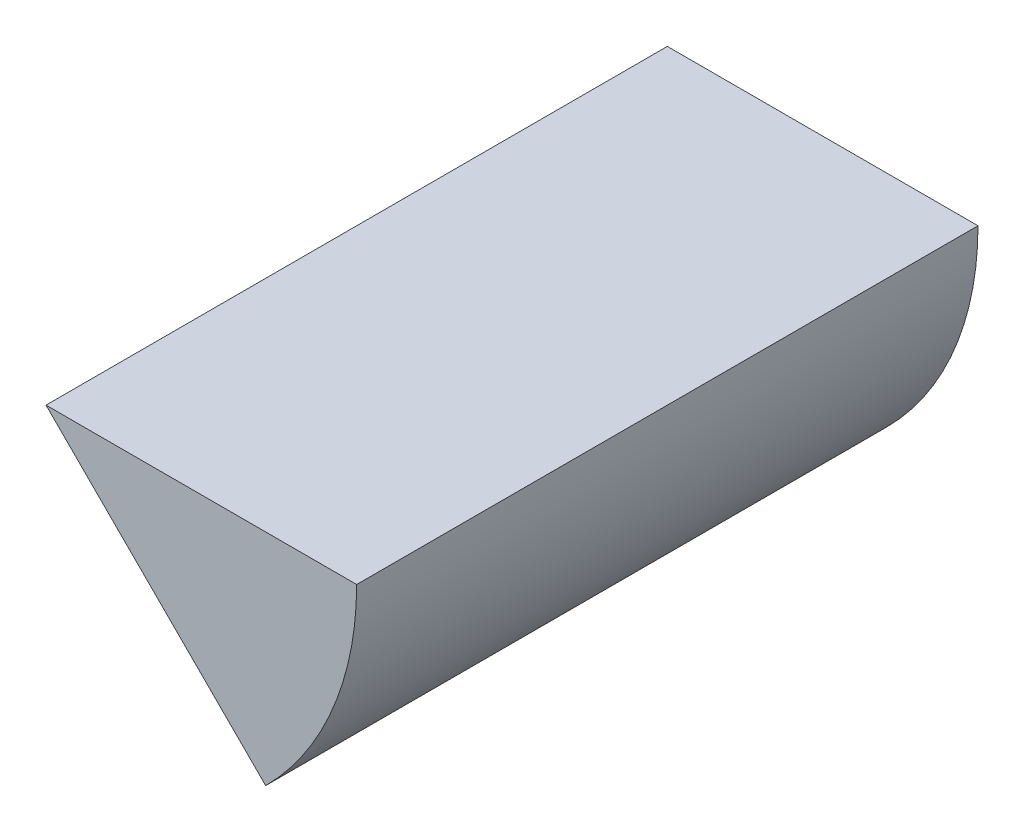
ISO-10303-21;
HEADER;
FILE_DESCRIPTION(('STEP AP214'),'2;1');
FILE_NAME('part.step','',(''),(''),'','','');
FILE_SCHEMA(('AUTOMOTIVE_DESIGN { 1 0 10303 214 1 1 1 1 }'));
ENDSEC;
DATA;
#1=APPLICATION_CONTEXT('core data for automotive mechanical design processes');
#2=APPLICATION_PROTOCOL_DEFINITION('international standard','automotive_design',2000,#1);
#3=PRODUCT_CONTEXT('',#1,'mechanical');
#4=PRODUCT('Part','Part','',(#3));
#5=PRODUCT_RELATED_PRODUCT_CATEGORY('part','',(#4));
#6=PRODUCT_DEFINITION_FORMATION('','',#4);
#7=PRODUCT_DEFINITION_CONTEXT('part definition',#1,'design');
#8=PRODUCT_DEFINITION('design','',#6,#7);
#9=PRODUCT_DEFINITION_SHAPE('','',#8);
#10=(LENGTH_UNIT() NAMED_UNIT(*) SI_UNIT(.MILLI.,.METRE.));
#11=(NAMED_UNIT(*) PLANE_ANGLE_UNIT() SI_UNIT($,.RADIAN.));
#12=(NAMED_UNIT(*) SI_UNIT($,.STERADIAN.) SOLID_ANGLE_UNIT());
#13=UNCERTAINTY_MEASURE_WITH_UNIT(LENGTH_MEASURE(1.E-05),#10,'distance_accuracy_value','');
#14=(GEOMETRIC_REPRESENTATION_CONTEXT(3) GLOBAL_UNCERTAINTY_ASSIGNED_CONTEXT((#13)) GLOBAL_UNIT_ASSIGNED_CONTEXT((#10,
#11,#12)) REPRESENTATION_CONTEXT('',''));
#15=CARTESIAN_POINT('',(0.,0.,0.));
#16=DIRECTION('',(0.,0.,1.));
#17=DIRECTION('',(1.,0.,0.));
#18=AXIS2_PLACEMENT_3D('',#15,#16,#17);
#19=CARTESIAN_POINT('',(0.,0.,50.));
#20=DIRECTION('',(0.707106781186544,0.707106781186551,0.));
#21=DIRECTION('',(-0.707106781186551,0.707106781186544,0.));
#22=AXIS2_PLACEMENT_3D('',#19,#20,#21);
#23=PLANE('',#22);
#24=DIRECTION('',(0.707106781186551,-0.707106781186544,0.));
#25=VECTOR('',#24,1.);
#26=CARTESIAN_POINT('',(0.,0.,0.));
#27=LINE('',#26,#25);
#28=CARTESIAN_POINT('',(0.,0.,0.));
#29=VERTEX_POINT('',#28);
#30=CARTESIAN_POINT('',(17.6776695296638,-17.6776695296636,0.));
#31=VERTEX_POINT('',#30);
#32=EDGE_CURVE('E80',#29,#31,#27,.T.);
#33=ORIENTED_EDGE('',*,*,#32,.T.);
#34=DIRECTION('',(0.,0.,-1.));
#35=VECTOR('',#34,1.);
#36=CARTESIAN_POINT('',(17.6776695296638,-17.6776695296636,50.));
#37=LINE('',#36,#35);
#38=CARTESIAN_POINT('',(17.6776695296638,-17.6776695296636,50.));
#39=VERTEX_POINT('',#38);
#40=EDGE_CURVE('E11',#39,#31,#37,.T.);
#41=ORIENTED_EDGE('',*,*,#40,.F.);
#42=DIRECTION('',(0.707106781186551,-0.707106781186544,0.));
#43=VECTOR('',#42,1.);
#44=CARTESIAN_POINT('',(0.,0.,50.));
#45=LINE('',#44,#43);
#46=CARTESIAN_POINT('',(0.,0.,50.));
#47=VERTEX_POINT('',#46);
#48=EDGE_CURVE('E73',#47,#39,#45,.T.);
#49=ORIENTED_EDGE('',*,*,#48,.F.);
#50=DIRECTION('',(0.,0.,-1.));
#51=VECTOR('',#50,1.);
#52=CARTESIAN_POINT('',(0.,0.,50.));
#53=LINE('',#52,#51);
#54=EDGE_CURVE('E81',#47,#29,#53,.T.);
#55=ORIENTED_EDGE('',*,*,#54,.T.);
#56=EDGE_LOOP('',(#33,#41,#49,#55));
#57=FACE_BOUND('',#56,.T.);
#58=ADVANCED_FACE('F33',(#57),#23,.F.);
#59=CARTESIAN_POINT('',(0.,0.,50.));
#60=DIRECTION('',(0.,0.,-1.));
#61=DIRECTION('',(-1.,0.,0.));
#62=AXIS2_PLACEMENT_3D('',#59,#60,#61);
#63=CYLINDRICAL_SURFACE('',#62,25.);
#64=CARTESIAN_POINT('',(0.,0.,0.));
#65=DIRECTION('',(0.,0.,1.));
#66=DIRECTION('',(1.,0.,0.));
#67=AXIS2_PLACEMENT_3D('',#64,#65,#66);
#68=CIRCLE('',#67,25.);
#69=CARTESIAN_POINT('',(25.,0.,0.));
#70=VERTEX_POINT('',#69);
#71=EDGE_CURVE('E61',#31,#70,#68,.T.);
#72=ORIENTED_EDGE('',*,*,#71,.T.);
#73=DIRECTION('',(0.,0.,-1.));
#74=VECTOR('',#73,1.);
#75=CARTESIAN_POINT('',(25.,0.,50.));
#76=LINE('',#75,#74);
#77=CARTESIAN_POINT('',(25.,0.,50.));
#78=VERTEX_POINT('',#77);
#79=EDGE_CURVE('E41',#78,#70,#76,.T.);
#80=ORIENTED_EDGE('',*,*,#79,.F.);
#81=CARTESIAN_POINT('',(0.,0.,50.));
#82=DIRECTION('',(0.,0.,1.));
#83=DIRECTION('',(1.,0.,0.));
#84=AXIS2_PLACEMENT_3D('',#81,#82,#83);
#85=CIRCLE('',#84,25.);
#86=EDGE_CURVE('E69',#39,#78,#85,.T.);
#87=ORIENTED_EDGE('',*,*,#86,.F.);
#88=ORIENTED_EDGE('',*,*,#40,.T.);
#89=EDGE_LOOP('',(#72,#80,#87,#88));
#90=FACE_BOUND('',#89,.T.);
#91=ADVANCED_FACE('F70',(#90),#63,.T.);
#92=CARTESIAN_POINT('',(25.,0.,50.));
#93=DIRECTION('',(0.,-1.,0.));
#94=DIRECTION('',(0.,0.,-1.));
#95=AXIS2_PLACEMENT_3D('',#92,#93,#94);
#96=PLANE('',#95);
#97=DIRECTION('',(-1.,0.,0.));
#98=VECTOR('',#97,1.);
#99=CARTESIAN_POINT('',(25.,0.,0.));
#100=LINE('',#99,#98);
#101=EDGE_CURVE('E66',#70,#29,#100,.T.);
#102=ORIENTED_EDGE('',*,*,#101,.T.);
#103=ORIENTED_EDGE('',*,*,#54,.F.);
#104=DIRECTION('',(-1.,0.,0.));
#105=VECTOR('',#104,1.);
#106=CARTESIAN_POINT('',(25.,0.,50.));
#107=LINE('',#106,#105);
#108=EDGE_CURVE('E49',#78,#47,#107,.T.);
#109=ORIENTED_EDGE('',*,*,#108,.F.);
#110=ORIENTED_EDGE('',*,*,#79,.T.);
#111=EDGE_LOOP('',(#102,#103,#109,#110));
#112=FACE_BOUND('',#111,.T.);
#113=ADVANCED_FACE('F92',(#112),#96,.F.);
#114=CARTESIAN_POINT('',(0.,0.,50.));
#115=DIRECTION('',(0.,0.,1.));
#116=DIRECTION('',(1.,0.,0.));
#117=AXIS2_PLACEMENT_3D('',#114,#115,#116);
#118=PLANE('',#117);
#119=ORIENTED_EDGE('',*,*,#48,.T.);
#120=ORIENTED_EDGE('',*,*,#86,.T.);
#121=ORIENTED_EDGE('',*,*,#108,.T.);
#122=EDGE_LOOP('',(#119,#120,#121));
#123=FACE_BOUND('',#122,.T.);
#124=ADVANCED_FACE('F76',(#123),#118,.T.);
#125=CARTESIAN_POINT('',(0.,0.,0.));
#126=DIRECTION('',(0.,0.,1.));
#127=DIRECTION('',(1.,0.,0.));
#128=AXIS2_PLACEMENT_3D('',#125,#126,#127);
#129=PLANE('',#128);
#130=CARTESIAN_POINT('',(16.7351464078845,-6.64563394646288,0.));
#131=DIRECTION('',(0.,0.,-1.));
#132=DIRECTION('',(-1.,0.,0.));
#133=AXIS2_PLACEMENT_3D('',#130,#131,#132);
#134=CIRCLE('',#133,5.);
#135=CARTESIAN_POINT('',(11.7351464078845,-6.64563394646288,0.));
#136=VERTEX_POINT('',#135);
#137=EDGE_CURVE('E87',#136,#136,#134,.T.);
#138=ORIENTED_EDGE('',*,*,#137,.F.);
#139=EDGE_LOOP('',(#138));
#140=FACE_BOUND('',#139,.T.);
#141=ORIENTED_EDGE('',*,*,#32,.F.);
#142=ORIENTED_EDGE('',*,*,#101,.F.);
#143=ORIENTED_EDGE('',*,*,#71,.F.);
#144=EDGE_LOOP('',(#141,#142,#143));
#145=FACE_BOUND('',#144,.T.);
#146=ADVANCED_FACE('F93',(#140,#145),#129,.F.);
#147=CARTESIAN_POINT('',(16.7351464078845,-6.64563394646288,10.));
#148=DIRECTION('',(0.,0.,-1.));
#149=DIRECTION('',(-1.,0.,0.));
#150=AXIS2_PLACEMENT_3D('',#147,#148,#149);
#151=CYLINDRICAL_SURFACE('',#150,5.);
#152=CARTESIAN_POINT('',(16.7351464078845,-6.64563394646288,10.));
#153=DIRECTION('',(0.,0.,-1.));
#154=DIRECTION('',(-1.,0.,0.));
#155=AXIS2_PLACEMENT_3D('',#152,#153,#154);
#156=CIRCLE('',#155,5.);
#157=CARTESIAN_POINT('',(11.7351464078845,-6.64563394646288,10.));
#158=VERTEX_POINT('',#157);
#159=EDGE_CURVE('E83',#158,#158,#156,.T.);
#160=ORIENTED_EDGE('',*,*,#159,.F.);
#161=EDGE_LOOP('',(#160));
#162=FACE_BOUND('',#161,.T.);
#163=ORIENTED_EDGE('',*,*,#137,.T.);
#164=EDGE_LOOP('',(#163));
#165=FACE_BOUND('',#164,.T.);
#166=ADVANCED_FACE('F95',(#162,#165),#151,.F.);
#167=CARTESIAN_POINT('',(16.7351464078845,-6.64563394646288,10.));
#168=DIRECTION('',(0.,0.,-1.));
#169=DIRECTION('',(-1.,0.,0.));
#170=AXIS2_PLACEMENT_3D('',#167,#168,#169);
#171=PLANE('',#170);
#172=ORIENTED_EDGE('',*,*,#159,.T.);
#173=EDGE_LOOP('',(#172));
#174=FACE_BOUND('',#173,.T.);
#175=ADVANCED_FACE('F102',(#174),#171,.T.);
#176=CLOSED_SHELL('',(#58,#91,#113,#124,#146,#166,#175));
#177=MANIFOLD_SOLID_BREP('B2',#176);
#178=ADVANCED_BREP_SHAPE_REPRESENTATION('',(#18,#177),#14);
#179=SHAPE_DEFINITION_REPRESENTATION(#9,#178);
ENDSEC;
END-ISO-10303-21;
